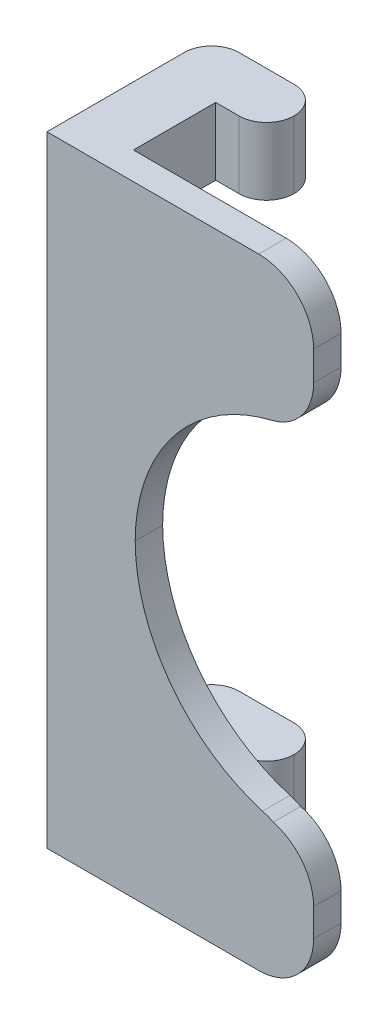
ISO-10303-21;
HEADER;
FILE_DESCRIPTION(('STEP AP214'),'2;1');
FILE_NAME('part.step','',(''),(''),'','','');
FILE_SCHEMA(('AUTOMOTIVE_DESIGN { 1 0 10303 214 1 1 1 1 }'));
ENDSEC;
DATA;
#1=APPLICATION_CONTEXT('core data for automotive mechanical design processes');
#2=APPLICATION_PROTOCOL_DEFINITION('international standard','automotive_design',2000,#1);
#3=PRODUCT_CONTEXT('',#1,'mechanical');
#4=PRODUCT('Part','Part','',(#3));
#5=PRODUCT_RELATED_PRODUCT_CATEGORY('part','',(#4));
#6=PRODUCT_DEFINITION_FORMATION('','',#4);
#7=PRODUCT_DEFINITION_CONTEXT('part definition',#1,'design');
#8=PRODUCT_DEFINITION('design','',#6,#7);
#9=PRODUCT_DEFINITION_SHAPE('','',#8);
#10=(LENGTH_UNIT() NAMED_UNIT(*) SI_UNIT(.MILLI.,.METRE.));
#11=(NAMED_UNIT(*) PLANE_ANGLE_UNIT() SI_UNIT($,.RADIAN.));
#12=(NAMED_UNIT(*) SI_UNIT($,.STERADIAN.) SOLID_ANGLE_UNIT());
#13=UNCERTAINTY_MEASURE_WITH_UNIT(LENGTH_MEASURE(1.E-05),#10,'distance_accuracy_value','');
#14=(GEOMETRIC_REPRESENTATION_CONTEXT(3) GLOBAL_UNCERTAINTY_ASSIGNED_CONTEXT((#13)) GLOBAL_UNIT_ASSIGNED_CONTEXT((#10,
#11,#12)) REPRESENTATION_CONTEXT('',''));
#15=CARTESIAN_POINT('',(0.,0.,0.));
#16=DIRECTION('',(0.,0.,1.));
#17=DIRECTION('',(1.,0.,0.));
#18=AXIS2_PLACEMENT_3D('',#15,#16,#17);
#19=CARTESIAN_POINT('',(0.,0.,0.));
#20=DIRECTION('',(0.,0.,1.));
#21=DIRECTION('',(1.,0.,0.));
#22=AXIS2_PLACEMENT_3D('',#19,#20,#21);
#23=PLANE('',#22);
#24=DIRECTION('',(1.,0.,0.));
#25=VECTOR('',#24,1.);
#26=CARTESIAN_POINT('',(0.,-36.4109482400217,0.));
#27=LINE('',#26,#25);
#28=CARTESIAN_POINT('',(52.7151769283594,-36.4109482400217,0.));
#29=VERTEX_POINT('',#28);
#30=CARTESIAN_POINT('',(58.2812352941176,-36.4109482400217,0.));
#31=VERTEX_POINT('',#30);
#32=EDGE_CURVE('E429',#29,#31,#27,.T.);
#33=ORIENTED_EDGE('',*,*,#32,.T.);
#34=CARTESIAN_POINT('',(58.2812352941176,-38.4109482400217,0.));
#35=DIRECTION('',(0.,0.,1.));
#36=DIRECTION('',(1.,0.,0.));
#37=AXIS2_PLACEMENT_3D('',#34,#35,#36);
#38=CIRCLE('',#37,2.);
#39=CARTESIAN_POINT('',(60.2812352941176,-38.4109482400217,0.));
#40=VERTEX_POINT('',#39);
#41=EDGE_CURVE('E490',#31,#40,#38,.F.);
#42=ORIENTED_EDGE('',*,*,#41,.T.);
#43=DIRECTION('',(0.,1.,0.));
#44=VECTOR('',#43,1.);
#45=CARTESIAN_POINT('',(60.2812352941176,-95.4267717694334,0.));
#46=LINE('',#45,#44);
#47=CARTESIAN_POINT('',(60.2812352941176,-39.4765924190925,0.));
#48=VERTEX_POINT('',#47);
#49=EDGE_CURVE('E248',#40,#48,#46,.F.);
#50=ORIENTED_EDGE('',*,*,#49,.T.);
#51=CARTESIAN_POINT('',(58.2812352941176,-39.4765924190925,0.));
#52=DIRECTION('',(0.,0.,1.));
#53=DIRECTION('',(1.,0.,0.));
#54=AXIS2_PLACEMENT_3D('',#51,#52,#53);
#55=CIRCLE('',#54,2.);
#56=CARTESIAN_POINT('',(58.7518235294118,-41.4204408475464,0.));
#57=VERTEX_POINT('',#56);
#58=EDGE_CURVE('E488',#48,#57,#55,.F.);
#59=ORIENTED_EDGE('',*,*,#58,.T.);
#60=CARTESIAN_POINT('',(60.2812352941176,-47.7379482400217,0.));
#61=DIRECTION('',(0.,0.,-1.));
#62=DIRECTION('',(1.,0.,0.));
#63=AXIS2_PLACEMENT_3D('',#60,#61,#62);
#64=CIRCLE('',#63,6.5);
#65=CARTESIAN_POINT('',(53.7812817026909,-47.7133858847167,0.));
#66=VERTEX_POINT('',#65);
#67=EDGE_CURVE('E246',#66,#57,#64,.T.);
#68=ORIENTED_EDGE('',*,*,#67,.F.);
#69=CARTESIAN_POINT('',(60.2812352941176,-47.6888235294118,0.));
#70=DIRECTION('',(0.,0.,1.));
#71=DIRECTION('',(1.,0.,0.));
#72=AXIS2_PLACEMENT_3D('',#69,#70,#71);
#73=CIRCLE('',#72,6.5);
#74=CARTESIAN_POINT('',(58.4222412319776,-53.9173178159089,0.));
#75=VERTEX_POINT('',#74);
#76=EDGE_CURVE('E433',#66,#75,#73,.T.);
#77=ORIENTED_EDGE('',*,*,#76,.T.);
#78=CARTESIAN_POINT('',(57.6776054850417,-59.0158235294118,0.));
#79=CARTESIAN_POINT('',(61.6748613716943,-59.0158235303762,0.));
#80=CARTESIAN_POINT('',(62.2525313016233,-55.060529347408,0.));
#81=CARTESIAN_POINT('',(58.4222412319776,-53.9173178159089,0.));
#82=(BOUNDED_CURVE() B_SPLINE_CURVE(3,(#78,#79,#80,#81),.UNSPECIFIED.,.F.,
.F.) B_SPLINE_CURVE_WITH_KNOTS((4,4),(0.,1.),
.UNSPECIFIED.) CURVE() GEOMETRIC_REPRESENTATION_ITEM() RATIONAL_B_SPLINE_CURVE((1.,
0.429677749837214,0.429677749837214,1.)) REPRESENTATION_ITEM(''));
#83=CARTESIAN_POINT('',(58.8167573565676,-54.0708231298666,0.));
#84=VERTEX_POINT('',#83);
#85=EDGE_CURVE('E560',#75,#84,#82,.F.);
#86=ORIENTED_EDGE('',*,*,#85,.T.);
#87=CARTESIAN_POINT('',(58.2812352941176,-55.9978247369354,0.));
#88=DIRECTION('',(0.,0.,1.));
#89=DIRECTION('',(1.,0.,0.));
#90=AXIS2_PLACEMENT_3D('',#87,#88,#89);
#91=CIRCLE('',#90,2.);
#92=CARTESIAN_POINT('',(60.2812352941176,-55.9978247369354,0.));
#93=VERTEX_POINT('',#92);
#94=EDGE_CURVE('E478',#84,#93,#91,.F.);
#95=ORIENTED_EDGE('',*,*,#94,.T.);
#96=DIRECTION('',(0.,1.,0.));
#97=VECTOR('',#96,1.);
#98=CARTESIAN_POINT('',(60.2812352941176,-95.4267717694334,0.));
#99=LINE('',#98,#97);
#100=CARTESIAN_POINT('',(60.2812352941176,-57.0158235294118,0.));
#101=VERTEX_POINT('',#100);
#102=EDGE_CURVE('E263',#93,#101,#99,.F.);
#103=ORIENTED_EDGE('',*,*,#102,.T.);
#104=CARTESIAN_POINT('',(58.2812352941176,-57.0158235294118,0.));
#105=DIRECTION('',(0.,0.,1.));
#106=DIRECTION('',(1.,0.,0.));
#107=AXIS2_PLACEMENT_3D('',#104,#105,#106);
#108=CIRCLE('',#107,2.);
#109=CARTESIAN_POINT('',(58.2812352941176,-59.0158235294118,0.));
#110=VERTEX_POINT('',#109);
#111=EDGE_CURVE('E484',#101,#110,#108,.F.);
#112=ORIENTED_EDGE('',*,*,#111,.T.);
#113=DIRECTION('',(1.,0.,0.));
#114=VECTOR('',#113,1.);
#115=CARTESIAN_POINT('',(0.,-59.0158235294118,0.));
#116=LINE('',#115,#114);
#117=CARTESIAN_POINT('',(52.7151769283594,-59.0158235294118,0.));
#118=VERTEX_POINT('',#117);
#119=EDGE_CURVE('E412',#118,#110,#116,.T.);
#120=ORIENTED_EDGE('',*,*,#119,.F.);
#121=DIRECTION('',(0.,-1.,0.));
#122=VECTOR('',#121,1.);
#123=CARTESIAN_POINT('',(52.7151769283594,0.,0.));
#124=LINE('',#123,#122);
#125=CARTESIAN_POINT('',(52.7151769283594,-56.5609482400217,0.));
#126=VERTEX_POINT('',#125);
#127=EDGE_CURVE('E450',#126,#118,#124,.T.);
#128=ORIENTED_EDGE('',*,*,#127,.F.);
#129=DIRECTION('',(1.,0.,0.));
#130=VECTOR('',#129,1.);
#131=CARTESIAN_POINT('',(0.,-56.5609482400217,0.));
#132=LINE('',#131,#130);
#133=CARTESIAN_POINT('',(50.5662352941177,-56.5609482400217,0.));
#134=VERTEX_POINT('',#133);
#135=EDGE_CURVE('E238',#134,#126,#132,.T.);
#136=ORIENTED_EDGE('',*,*,#135,.F.);
#137=DIRECTION('',(0.,1.,0.));
#138=VECTOR('',#137,1.);
#139=CARTESIAN_POINT('',(50.5662352941177,0.,0.));
#140=LINE('',#139,#138);
#141=CARTESIAN_POINT('',(50.5662352941177,-38.8658235294118,0.));
#142=VERTEX_POINT('',#141);
#143=EDGE_CURVE('E432',#134,#142,#140,.T.);
#144=ORIENTED_EDGE('',*,*,#143,.T.);
#145=DIRECTION('',(1.,0.,0.));
#146=VECTOR('',#145,1.);
#147=CARTESIAN_POINT('',(0.,-38.8658235294118,0.));
#148=LINE('',#147,#146);
#149=CARTESIAN_POINT('',(52.7151769283594,-38.8658235294118,0.));
#150=VERTEX_POINT('',#149);
#151=EDGE_CURVE('E434',#142,#150,#148,.T.);
#152=ORIENTED_EDGE('',*,*,#151,.T.);
#153=DIRECTION('',(0.,1.,0.));
#154=VECTOR('',#153,1.);
#155=CARTESIAN_POINT('',(52.7151769283594,0.,0.));
#156=LINE('',#155,#154);
#157=EDGE_CURVE('E557',#150,#29,#156,.T.);
#158=ORIENTED_EDGE('',*,*,#157,.T.);
#159=EDGE_LOOP('',(#33,#42,#50,#59,#68,#77,#86,#95,#103,#112,#120,#128,#136,#144,#152,#158));
#160=FACE_BOUND('',#159,.T.);
#161=ADVANCED_FACE('F37',(#160),#23,.F.);
#162=CARTESIAN_POINT('',(58.4222412322629,-53.9173178159941,1.1));
#163=CARTESIAN_POINT('',(58.4222412322629,-53.9173178159941,1.06666666666667));
#164=CARTESIAN_POINT('',(58.4222412319776,-53.9173178159089,1.03333333333333));
#165=CARTESIAN_POINT('',(58.4222412319776,-53.9173178159089,0.666666666666658));
#166=CARTESIAN_POINT('',(58.4222412319776,-53.9173178159089,0.333333333333323));
#167=CARTESIAN_POINT('',(58.4222412319776,-53.9173178159089,-0.0333333333333324));
#168=CARTESIAN_POINT('',(58.4222412322629,-53.9173178159941,-0.066666666666667));
#169=CARTESIAN_POINT('',(58.4222412322629,-53.9173178159941,-0.1));
#170=CARTESIAN_POINT('',(62.2525313012011,-55.0605293474134,1.1));
#171=CARTESIAN_POINT('',(62.2525313012011,-55.0605293474134,1.06666666666667));
#172=CARTESIAN_POINT('',(62.2525313016233,-55.060529347408,1.03333333333333));
#173=CARTESIAN_POINT('',(62.2525313016233,-55.060529347408,0.666666666666658));
#174=CARTESIAN_POINT('',(62.2525313016233,-55.060529347408,0.333333333333323));
#175=CARTESIAN_POINT('',(62.2525313016233,-55.060529347408,-0.0333333333333324));
#176=CARTESIAN_POINT('',(62.2525313012011,-55.0605293474134,-0.066666666666667));
#177=CARTESIAN_POINT('',(62.2525313012011,-55.0605293474134,-0.1));
#178=CARTESIAN_POINT('',(61.6748613715533,-59.0158235298299,1.1));
#179=CARTESIAN_POINT('',(61.6748613715533,-59.0158235298299,1.06666666666667));
#180=CARTESIAN_POINT('',(61.6748613716943,-59.0158235303762,1.03333333333333));
#181=CARTESIAN_POINT('',(61.6748613716943,-59.0158235303762,0.666666666666658));
#182=CARTESIAN_POINT('',(61.6748613716943,-59.0158235303762,0.333333333333323));
#183=CARTESIAN_POINT('',(61.6748613716943,-59.0158235303762,-0.0333333333333324));
#184=CARTESIAN_POINT('',(61.6748613715533,-59.0158235298299,-0.066666666666667));
#185=CARTESIAN_POINT('',(61.6748613715533,-59.0158235298299,-0.1));
#186=CARTESIAN_POINT('',(57.6776054856014,-59.0158235294118,1.1));
#187=CARTESIAN_POINT('',(57.6776054856014,-59.0158235294118,1.06666666666667));
#188=CARTESIAN_POINT('',(57.6776054850417,-59.0158235294118,1.03333333333333));
#189=CARTESIAN_POINT('',(57.6776054850417,-59.0158235294118,0.666666666666658));
#190=CARTESIAN_POINT('',(57.6776054850417,-59.0158235294118,0.333333333333323));
#191=CARTESIAN_POINT('',(57.6776054850417,-59.0158235294118,-0.0333333333333324));
#192=CARTESIAN_POINT('',(57.6776054856014,-59.0158235294118,-0.066666666666667));
#193=CARTESIAN_POINT('',(57.6776054856014,-59.0158235294118,-0.1));
#194=(BOUNDED_SURFACE() B_SPLINE_SURFACE(3,3,((#162,#163,#164,#165,#166,#167,#168,#169),(#170,
#171,#172,#173,#174,#175,#176,#177),(#178,#179,#180,#181,#182,#183,#184,#185),(#186,#187,#188,
#189,#190,#191,#192,#193)),.UNSPECIFIED.,.F.,.F.,.F.) B_SPLINE_SURFACE_WITH_KNOTS((4,4),(4,2,2,
4),(0.,1.),(-0.1,0.,1.,1.1),
.UNSPECIFIED.) GEOMETRIC_REPRESENTATION_ITEM() RATIONAL_B_SPLINE_SURFACE(((1.,1.,1.,1.,1.,1.,1.,
1.),(0.429677749892681,0.429677749892681,0.429677749837214,0.429677749837214,0.429677749837214,
0.429677749837214,0.429677749892681,0.429677749892681),(0.429677749892681,0.429677749892681,
0.429677749837214,0.429677749837214,0.429677749837214,0.429677749837214,0.429677749892681,
0.429677749892681),(1.,1.,1.,1.,1.,1.,1.,1.))) REPRESENTATION_ITEM('') SURFACE());
#195=CARTESIAN_POINT('',(58.4222412319776,-53.9173178159089,1.));
#196=CARTESIAN_POINT('',(62.2525313016233,-55.060529347408,1.));
#197=CARTESIAN_POINT('',(61.6748613716943,-59.0158235303762,1.));
#198=CARTESIAN_POINT('',(57.6776054850417,-59.0158235294118,1.));
#199=(BOUNDED_CURVE() B_SPLINE_CURVE(3,(#195,#196,#197,#198),.UNSPECIFIED.,.F.,
.F.) B_SPLINE_CURVE_WITH_KNOTS((4,4),(0.,1.),
.UNSPECIFIED.) CURVE() GEOMETRIC_REPRESENTATION_ITEM() RATIONAL_B_SPLINE_CURVE((1.,
0.429677749837214,0.429677749837214,1.)) REPRESENTATION_ITEM(''));
#200=CARTESIAN_POINT('',(58.8168564094262,-54.0708460350338,1.));
#201=VERTEX_POINT('',#200);
#202=CARTESIAN_POINT('',(58.4222412319776,-53.9173178159089,1.));
#203=VERTEX_POINT('',#202);
#204=EDGE_CURVE('E405',#201,#203,#199,.F.);
#205=CARTESIAN_POINT('',(58.8160917387916,-54.0706691688394,1.00000000000002));
#206=CARTESIAN_POINT('',(58.816091738614,-54.0706691687983,0.900000000000013));
#207=CARTESIAN_POINT('',(58.8160917385301,-54.0706691687789,0.800000000000009));
#208=CARTESIAN_POINT('',(58.816091738461,-54.0706691687629,0.600000000000002));
#209=CARTESIAN_POINT('',(58.8160917384759,-54.0706691687664,0.499999999999998));
#210=CARTESIAN_POINT('',(58.8160917385219,-54.0706691687771,0.266666666666663));
#211=CARTESIAN_POINT('',(58.816091738557,-54.0706691687852,0.133333333333332));
#212=CARTESIAN_POINT('',(58.8160917384956,-54.0706691687709,0.));
#213=B_SPLINE_CURVE_WITH_KNOTS('',3,(#205,#206,#207,#208,#209,#210,#211,#212),.UNSPECIFIED.,.F.,
.F.,(4,2,2,4),(0.,0.300000000000011,0.600000000000023,1.00000000000002),.UNSPECIFIED.);
#214=EDGE_CURVE('E267',#201,#84,#213,.T.);
#215=CARTESIAN_POINT('',(58.4222412322629,-53.9173178159941,-0.1));
#216=CARTESIAN_POINT('',(58.4222412322629,-53.9173178159941,-0.066666666666667));
#217=CARTESIAN_POINT('',(58.4222412319776,-53.9173178159089,-0.0333333333333324));
#218=CARTESIAN_POINT('',(58.4222412319776,-53.9173178159089,0.333333333333323));
#219=CARTESIAN_POINT('',(58.4222412319776,-53.9173178159089,0.666666666666658));
#220=CARTESIAN_POINT('',(58.4222412319776,-53.9173178159089,1.03333333333333));
#221=CARTESIAN_POINT('',(58.4222412322629,-53.9173178159941,1.06666666666667));
#222=CARTESIAN_POINT('',(58.4222412322629,-53.9173178159941,1.1));
#223=(BOUNDED_CURVE() B_SPLINE_CURVE(3,(#215,#216,#217,#218,#219,#220,#221,#222),.UNSPECIFIED.,
.F.,.F.) B_SPLINE_CURVE_WITH_KNOTS((4,2,2,4),(-0.1,0.,1.,1.1),
.UNSPECIFIED.) CURVE() GEOMETRIC_REPRESENTATION_ITEM() RATIONAL_B_SPLINE_CURVE((1.,1.,1.,1.,1.,
1.,1.,1.)) REPRESENTATION_ITEM(''));
#224=EDGE_CURVE('E383',#203,#75,#223,.F.);
#225=ORIENTED_EDGE('',*,*,#204,.F.);
#226=ORIENTED_EDGE('',*,*,#214,.T.);
#227=ORIENTED_EDGE('',*,*,#85,.F.);
#228=ORIENTED_EDGE('',*,*,#224,.F.);
#229=EDGE_LOOP('',(#225,#226,#227,#228));
#230=FACE_BOUND('',#229,.T.);
#231=ADVANCED_FACE('F283',(#230),#194,.T.);
#232=CARTESIAN_POINT('',(60.2812352941176,-47.6888235294118,1.));
#233=DIRECTION('',(0.,0.,-1.));
#234=DIRECTION('',(-1.,0.,0.));
#235=AXIS2_PLACEMENT_3D('',#232,#233,#234);
#236=CYLINDRICAL_SURFACE('',#235,6.5);
#237=ORIENTED_EDGE('',*,*,#76,.F.);
#238=DIRECTION('',(0.,0.,-1.));
#239=VECTOR('',#238,1.);
#240=CARTESIAN_POINT('',(53.7812817026909,-47.7133858847167,0.5));
#241=LINE('',#240,#239);
#242=CARTESIAN_POINT('',(53.7812817026909,-47.7133858847167,1.));
#243=VERTEX_POINT('',#242);
#244=EDGE_CURVE('E264',#66,#243,#241,.F.);
#245=ORIENTED_EDGE('',*,*,#244,.T.);
#246=CARTESIAN_POINT('',(60.2812352941176,-47.6888235294118,1.));
#247=DIRECTION('',(0.,0.,1.));
#248=DIRECTION('',(1.,0.,0.));
#249=AXIS2_PLACEMENT_3D('',#246,#247,#248);
#250=CIRCLE('',#249,6.5);
#251=EDGE_CURVE('E408',#243,#203,#250,.T.);
#252=ORIENTED_EDGE('',*,*,#251,.T.);
#253=ORIENTED_EDGE('',*,*,#224,.T.);
#254=EDGE_LOOP('',(#237,#245,#252,#253));
#255=FACE_BOUND('',#254,.T.);
#256=ADVANCED_FACE('F355',(#255),#236,.F.);
#257=CARTESIAN_POINT('',(0.,-36.4109482400217,1.));
#258=DIRECTION('',(0.,1.,0.));
#259=DIRECTION('',(0.,0.,1.));
#260=AXIS2_PLACEMENT_3D('',#257,#258,#259);
#261=PLANE('',#260);
#262=DIRECTION('',(1.,0.,0.));
#263=VECTOR('',#262,1.);
#264=CARTESIAN_POINT('',(0.,-36.4109482400217,1.));
#265=LINE('',#264,#263);
#266=CARTESIAN_POINT('',(50.5662352941177,-36.4109482400217,1.));
#267=VERTEX_POINT('',#266);
#268=CARTESIAN_POINT('',(58.2812352941176,-36.4109482400217,1.));
#269=VERTEX_POINT('',#268);
#270=EDGE_CURVE('E411',#267,#269,#265,.T.);
#271=ORIENTED_EDGE('',*,*,#270,.T.);
#272=DIRECTION('',(0.,0.,-1.));
#273=VECTOR('',#272,1.);
#274=CARTESIAN_POINT('',(58.2812352941176,-36.4109482400217,1.));
#275=LINE('',#274,#273);
#276=EDGE_CURVE('E473',#269,#31,#275,.T.);
#277=ORIENTED_EDGE('',*,*,#276,.T.);
#278=ORIENTED_EDGE('',*,*,#32,.F.);
#279=DIRECTION('',(0.,0.,1.));
#280=VECTOR('',#279,1.);
#281=CARTESIAN_POINT('',(52.7151769283594,-36.4109482400217,-6.2625699737838));
#282=LINE('',#281,#280);
#283=CARTESIAN_POINT('',(52.7151769283594,-36.4109482400217,-3.));
#284=VERTEX_POINT('',#283);
#285=EDGE_CURVE('E531',#284,#29,#282,.T.);
#286=ORIENTED_EDGE('',*,*,#285,.F.);
#287=DIRECTION('',(1.,0.,0.));
#288=VECTOR('',#287,1.);
#289=CARTESIAN_POINT('',(50.5662352941177,-36.4109482400217,-3.));
#290=LINE('',#289,#288);
#291=CARTESIAN_POINT('',(53.5662352941177,-36.4109482400217,-3.));
#292=VERTEX_POINT('',#291);
#293=EDGE_CURVE('E536',#284,#292,#290,.T.);
#294=ORIENTED_EDGE('',*,*,#293,.T.);
#295=CARTESIAN_POINT('',(53.5662352941177,-36.4109482400217,-4.));
#296=DIRECTION('',(0.,1.,0.));
#297=DIRECTION('',(0.,0.,1.));
#298=AXIS2_PLACEMENT_3D('',#295,#296,#297);
#299=CIRCLE('',#298,1.);
#300=CARTESIAN_POINT('',(54.5662352941177,-36.4109482400217,-4.));
#301=VERTEX_POINT('',#300);
#302=EDGE_CURVE('E543',#292,#301,#299,.T.);
#303=ORIENTED_EDGE('',*,*,#302,.T.);
#304=CARTESIAN_POINT('',(53.5662352941177,-36.4109482400217,-4.));
#305=DIRECTION('',(0.,1.,0.));
#306=DIRECTION('',(0.,0.,1.));
#307=AXIS2_PLACEMENT_3D('',#304,#305,#306);
#308=CIRCLE('',#307,1.);
#309=CARTESIAN_POINT('',(53.5662352941177,-36.4109482400217,-5.));
#310=VERTEX_POINT('',#309);
#311=EDGE_CURVE('E545',#301,#310,#308,.T.);
#312=ORIENTED_EDGE('',*,*,#311,.T.);
#313=DIRECTION('',(1.,0.,0.));
#314=VECTOR('',#313,1.);
#315=CARTESIAN_POINT('',(50.5662352941177,-36.4109482400217,-5.));
#316=LINE('',#315,#314);
#317=CARTESIAN_POINT('',(51.5662352941177,-36.4109482400217,-5.));
#318=VERTEX_POINT('',#317);
#319=EDGE_CURVE('E280',#318,#310,#316,.T.);
#320=ORIENTED_EDGE('',*,*,#319,.F.);
#321=CARTESIAN_POINT('',(51.5662352941177,-36.4109482400217,-4.));
#322=DIRECTION('',(0.,1.,0.));
#323=DIRECTION('',(0.,0.,1.));
#324=AXIS2_PLACEMENT_3D('',#321,#322,#323);
#325=CIRCLE('',#324,1.);
#326=CARTESIAN_POINT('',(50.5662352941177,-36.4109482400217,-4.));
#327=VERTEX_POINT('',#326);
#328=EDGE_CURVE('E547',#318,#327,#325,.T.);
#329=ORIENTED_EDGE('',*,*,#328,.T.);
#330=DIRECTION('',(0.,0.,-1.));
#331=VECTOR('',#330,1.);
#332=CARTESIAN_POINT('',(50.5662352941177,-36.4109482400217,1.));
#333=LINE('',#332,#331);
#334=EDGE_CURVE('E518',#267,#327,#333,.T.);
#335=ORIENTED_EDGE('',*,*,#334,.F.);
#336=EDGE_LOOP('',(#271,#277,#278,#286,#294,#303,#312,#320,#329,#335));
#337=FACE_BOUND('',#336,.T.);
#338=ADVANCED_FACE('F515',(#337),#261,.T.);
#339=CARTESIAN_POINT('',(50.5662352941177,0.,1.));
#340=DIRECTION('',(-1.,0.,0.));
#341=DIRECTION('',(0.,0.,1.));
#342=AXIS2_PLACEMENT_3D('',#339,#340,#341);
#343=PLANE('',#342);
#344=DIRECTION('',(0.,0.,1.));
#345=VECTOR('',#344,1.);
#346=CARTESIAN_POINT('',(50.5662352941177,-56.5609482400217,-6.2625699737838));
#347=LINE('',#346,#345);
#348=CARTESIAN_POINT('',(50.5662352941177,-56.5609482400217,-4.));
#349=VERTEX_POINT('',#348);
#350=EDGE_CURVE('E241',#349,#134,#347,.T.);
#351=ORIENTED_EDGE('',*,*,#350,.F.);
#352=DIRECTION('',(0.,-1.,0.));
#353=VECTOR('',#352,1.);
#354=CARTESIAN_POINT('',(50.5662352941177,-59.0158235294118,-4.));
#355=LINE('',#354,#353);
#356=CARTESIAN_POINT('',(50.5662352941177,-59.0158235294118,-4.));
#357=VERTEX_POINT('',#356);
#358=EDGE_CURVE('E470',#349,#357,#355,.T.);
#359=ORIENTED_EDGE('',*,*,#358,.T.);
#360=DIRECTION('',(0.,0.,-1.));
#361=VECTOR('',#360,1.);
#362=CARTESIAN_POINT('',(50.5662352941177,-59.0158235294118,1.));
#363=LINE('',#362,#361);
#364=CARTESIAN_POINT('',(50.5662352941177,-59.0158235294118,1.));
#365=VERTEX_POINT('',#364);
#366=EDGE_CURVE('E443',#365,#357,#363,.T.);
#367=ORIENTED_EDGE('',*,*,#366,.F.);
#368=DIRECTION('',(0.,1.,0.));
#369=VECTOR('',#368,1.);
#370=CARTESIAN_POINT('',(50.5662352941177,0.,1.));
#371=LINE('',#370,#369);
#372=EDGE_CURVE('E422',#365,#267,#371,.T.);
#373=ORIENTED_EDGE('',*,*,#372,.T.);
#374=ORIENTED_EDGE('',*,*,#334,.T.);
#375=DIRECTION('',(0.,1.,0.));
#376=VECTOR('',#375,1.);
#377=CARTESIAN_POINT('',(50.5662352941177,-38.8658235294118,-4.));
#378=LINE('',#377,#376);
#379=CARTESIAN_POINT('',(50.5662352941177,-38.8658235294118,-4.));
#380=VERTEX_POINT('',#379);
#381=EDGE_CURVE('E451',#327,#380,#378,.F.);
#382=ORIENTED_EDGE('',*,*,#381,.T.);
#383=DIRECTION('',(0.,0.,1.));
#384=VECTOR('',#383,1.);
#385=CARTESIAN_POINT('',(50.5662352941177,-38.8658235294118,-6.2625699737838));
#386=LINE('',#385,#384);
#387=EDGE_CURVE('E418',#380,#142,#386,.T.);
#388=ORIENTED_EDGE('',*,*,#387,.T.);
#389=ORIENTED_EDGE('',*,*,#143,.F.);
#390=EDGE_LOOP('',(#351,#359,#367,#373,#374,#382,#388,#389));
#391=FACE_BOUND('',#390,.T.);
#392=ADVANCED_FACE('F578',(#391),#343,.T.);
#393=CARTESIAN_POINT('',(0.,-59.0158235294118,1.));
#394=DIRECTION('',(0.,1.,0.));
#395=DIRECTION('',(0.,0.,1.));
#396=AXIS2_PLACEMENT_3D('',#393,#394,#395);
#397=PLANE('',#396);
#398=ORIENTED_EDGE('',*,*,#119,.T.);
#399=DIRECTION('',(0.,0.,-1.));
#400=VECTOR('',#399,1.);
#401=CARTESIAN_POINT('',(58.2812352941176,-59.0158235294118,1.));
#402=LINE('',#401,#400);
#403=CARTESIAN_POINT('',(58.2812352941176,-59.0158235294118,1.));
#404=VERTEX_POINT('',#403);
#405=EDGE_CURVE('E11',#110,#404,#402,.F.);
#406=ORIENTED_EDGE('',*,*,#405,.T.);
#407=DIRECTION('',(1.,0.,0.));
#408=VECTOR('',#407,1.);
#409=CARTESIAN_POINT('',(0.,-59.0158235294118,1.));
#410=LINE('',#409,#408);
#411=EDGE_CURVE('E564',#365,#404,#410,.T.);
#412=ORIENTED_EDGE('',*,*,#411,.F.);
#413=ORIENTED_EDGE('',*,*,#366,.T.);
#414=CARTESIAN_POINT('',(51.5662352941177,-59.0158235294118,-4.));
#415=DIRECTION('',(0.,1.,0.));
#416=DIRECTION('',(0.,0.,1.));
#417=AXIS2_PLACEMENT_3D('',#414,#415,#416);
#418=CIRCLE('',#417,1.);
#419=CARTESIAN_POINT('',(51.5662352941177,-59.0158235294118,-5.));
#420=VERTEX_POINT('',#419);
#421=EDGE_CURVE('E460',#357,#420,#418,.F.);
#422=ORIENTED_EDGE('',*,*,#421,.T.);
#423=DIRECTION('',(1.,0.,0.));
#424=VECTOR('',#423,1.);
#425=CARTESIAN_POINT('',(50.5662352941177,-59.0158235294118,-5.));
#426=LINE('',#425,#424);
#427=CARTESIAN_POINT('',(53.5662352941177,-59.0158235294118,-5.));
#428=VERTEX_POINT('',#427);
#429=EDGE_CURVE('E254',#420,#428,#426,.T.);
#430=ORIENTED_EDGE('',*,*,#429,.T.);
#431=CARTESIAN_POINT('',(53.5662352941177,-59.0158235294118,-4.));
#432=DIRECTION('',(0.,1.,0.));
#433=DIRECTION('',(0.,0.,1.));
#434=AXIS2_PLACEMENT_3D('',#431,#432,#433);
#435=CIRCLE('',#434,1.);
#436=CARTESIAN_POINT('',(54.5662352941177,-59.0158235294118,-4.));
#437=VERTEX_POINT('',#436);
#438=EDGE_CURVE('E462',#428,#437,#435,.F.);
#439=ORIENTED_EDGE('',*,*,#438,.T.);
#440=CARTESIAN_POINT('',(53.5662352941177,-59.0158235294118,-4.));
#441=DIRECTION('',(0.,1.,0.));
#442=DIRECTION('',(0.,0.,1.));
#443=AXIS2_PLACEMENT_3D('',#440,#441,#442);
#444=CIRCLE('',#443,1.);
#445=CARTESIAN_POINT('',(53.5662352941177,-59.0158235294118,-3.));
#446=VERTEX_POINT('',#445);
#447=EDGE_CURVE('E464',#437,#446,#444,.F.);
#448=ORIENTED_EDGE('',*,*,#447,.T.);
#449=DIRECTION('',(1.,0.,0.));
#450=VECTOR('',#449,1.);
#451=CARTESIAN_POINT('',(50.5662352941177,-59.0158235294118,-3.));
#452=LINE('',#451,#450);
#453=CARTESIAN_POINT('',(52.7151769283594,-59.0158235294118,-3.));
#454=VERTEX_POINT('',#453);
#455=EDGE_CURVE('E230',#454,#446,#452,.T.);
#456=ORIENTED_EDGE('',*,*,#455,.F.);
#457=DIRECTION('',(0.,0.,1.));
#458=VECTOR('',#457,1.);
#459=CARTESIAN_POINT('',(52.7151769283594,-59.0158235294118,-6.2625699737838));
#460=LINE('',#459,#458);
#461=EDGE_CURVE('E242',#454,#118,#460,.T.);
#462=ORIENTED_EDGE('',*,*,#461,.T.);
#463=EDGE_LOOP('',(#398,#406,#412,#413,#422,#430,#439,#448,#456,#462));
#464=FACE_BOUND('',#463,.T.);
#465=ADVANCED_FACE('F364',(#464),#397,.F.);
#466=CARTESIAN_POINT('',(0.,0.,1.));
#467=DIRECTION('',(0.,0.,1.));
#468=DIRECTION('',(1.,0.,0.));
#469=AXIS2_PLACEMENT_3D('',#466,#467,#468);
#470=PLANE('',#469);
#471=DIRECTION('',(0.,-1.,0.));
#472=VECTOR('',#471,1.);
#473=CARTESIAN_POINT('',(60.2812352941176,-95.4267717694334,1.));
#474=LINE('',#473,#472);
#475=CARTESIAN_POINT('',(60.2812352941176,-38.4109482400217,1.));
#476=VERTEX_POINT('',#475);
#477=CARTESIAN_POINT('',(60.2812352941176,-39.4765924190925,1.));
#478=VERTEX_POINT('',#477);
#479=EDGE_CURVE('E262',#476,#478,#474,.T.);
#480=ORIENTED_EDGE('',*,*,#479,.F.);
#481=CARTESIAN_POINT('',(58.2812352941176,-38.4109482400217,1.));
#482=DIRECTION('',(0.,0.,1.));
#483=DIRECTION('',(1.,0.,0.));
#484=AXIS2_PLACEMENT_3D('',#481,#482,#483);
#485=CIRCLE('',#484,2.);
#486=EDGE_CURVE('E506',#476,#269,#485,.T.);
#487=ORIENTED_EDGE('',*,*,#486,.T.);
#488=ORIENTED_EDGE('',*,*,#270,.F.);
#489=ORIENTED_EDGE('',*,*,#372,.F.);
#490=ORIENTED_EDGE('',*,*,#411,.T.);
#491=CARTESIAN_POINT('',(58.2812352941176,-57.0158235294118,1.));
#492=DIRECTION('',(0.,0.,1.));
#493=DIRECTION('',(1.,0.,0.));
#494=AXIS2_PLACEMENT_3D('',#491,#492,#493);
#495=CIRCLE('',#494,2.);
#496=CARTESIAN_POINT('',(60.2812352941176,-57.0158235294118,1.));
#497=VERTEX_POINT('',#496);
#498=EDGE_CURVE('E67',#404,#497,#495,.T.);
#499=ORIENTED_EDGE('',*,*,#498,.T.);
#500=CARTESIAN_POINT('',(60.2812352941176,-55.9978247369354,1.));
#501=VERTEX_POINT('',#500);
#502=EDGE_CURVE('E268',#501,#497,#474,.T.);
#503=ORIENTED_EDGE('',*,*,#502,.F.);
#504=CARTESIAN_POINT('',(58.2812352941176,-55.9978247369354,1.));
#505=DIRECTION('',(0.,0.,1.));
#506=DIRECTION('',(1.,0.,0.));
#507=AXIS2_PLACEMENT_3D('',#504,#505,#506);
#508=CIRCLE('',#507,2.);
#509=EDGE_CURVE('E499',#501,#201,#508,.T.);
#510=ORIENTED_EDGE('',*,*,#509,.T.);
#511=ORIENTED_EDGE('',*,*,#204,.T.);
#512=ORIENTED_EDGE('',*,*,#251,.F.);
#513=CARTESIAN_POINT('',(60.2812352941176,-47.7379482400217,1.));
#514=DIRECTION('',(0.,0.,-1.));
#515=DIRECTION('',(1.,0.,0.));
#516=AXIS2_PLACEMENT_3D('',#513,#514,#515);
#517=CIRCLE('',#516,6.5);
#518=CARTESIAN_POINT('',(58.7518235294118,-41.4204408475464,1.));
#519=VERTEX_POINT('',#518);
#520=EDGE_CURVE('E260',#243,#519,#517,.T.);
#521=ORIENTED_EDGE('',*,*,#520,.T.);
#522=CARTESIAN_POINT('',(58.2812352941176,-39.4765924190925,1.));
#523=DIRECTION('',(0.,0.,1.));
#524=DIRECTION('',(1.,0.,0.));
#525=AXIS2_PLACEMENT_3D('',#522,#523,#524);
#526=CIRCLE('',#525,2.);
#527=EDGE_CURVE('E505',#519,#478,#526,.T.);
#528=ORIENTED_EDGE('',*,*,#527,.T.);
#529=EDGE_LOOP('',(#480,#487,#488,#489,#490,#499,#503,#510,#511,#512,#521,#528));
#530=FACE_BOUND('',#529,.T.);
#531=ADVANCED_FACE('F361',(#530),#470,.T.);
#532=CARTESIAN_POINT('',(52.7151769283594,-36.4109482400217,-6.2625699737838));
#533=DIRECTION('',(1.,0.,0.));
#534=DIRECTION('',(0.,0.,-1.));
#535=AXIS2_PLACEMENT_3D('',#532,#533,#534);
#536=PLANE('',#535);
#537=ORIENTED_EDGE('',*,*,#157,.F.);
#538=DIRECTION('',(0.,0.,1.));
#539=VECTOR('',#538,1.);
#540=CARTESIAN_POINT('',(52.7151769283594,-38.8658235294118,-6.2625699737838));
#541=LINE('',#540,#539);
#542=CARTESIAN_POINT('',(52.7151769283594,-38.8658235294118,-3.));
#543=VERTEX_POINT('',#542);
#544=EDGE_CURVE('E645',#543,#150,#541,.T.);
#545=ORIENTED_EDGE('',*,*,#544,.F.);
#546=DIRECTION('',(0.,-1.,0.));
#547=VECTOR('',#546,1.);
#548=CARTESIAN_POINT('',(52.7151769283594,-36.4109482400217,-3.));
#549=LINE('',#548,#547);
#550=EDGE_CURVE('E529',#284,#543,#549,.T.);
#551=ORIENTED_EDGE('',*,*,#550,.F.);
#552=ORIENTED_EDGE('',*,*,#285,.T.);
#553=EDGE_LOOP('',(#537,#545,#551,#552));
#554=FACE_BOUND('',#553,.T.);
#555=ADVANCED_FACE('F661',(#554),#536,.T.);
#556=CARTESIAN_POINT('',(50.5662352941177,-38.8658235294118,-6.2625699737838));
#557=DIRECTION('',(0.,-1.,0.));
#558=DIRECTION('',(0.,0.,-1.));
#559=AXIS2_PLACEMENT_3D('',#556,#557,#558);
#560=PLANE('',#559);
#561=CARTESIAN_POINT('',(53.5662352941177,-38.8658235294118,-4.));
#562=DIRECTION('',(0.,-1.,0.));
#563=DIRECTION('',(0.,0.,-1.));
#564=AXIS2_PLACEMENT_3D('',#561,#562,#563);
#565=CIRCLE('',#564,1.);
#566=CARTESIAN_POINT('',(53.5662352941177,-38.8658235294118,-5.));
#567=VERTEX_POINT('',#566);
#568=CARTESIAN_POINT('',(54.5662352941177,-38.8658235294118,-4.));
#569=VERTEX_POINT('',#568);
#570=EDGE_CURVE('E554',#567,#569,#565,.T.);
#571=ORIENTED_EDGE('',*,*,#570,.T.);
#572=CARTESIAN_POINT('',(53.5662352941177,-38.8658235294118,-4.));
#573=DIRECTION('',(0.,-1.,0.));
#574=DIRECTION('',(0.,0.,-1.));
#575=AXIS2_PLACEMENT_3D('',#572,#573,#574);
#576=CIRCLE('',#575,1.);
#577=CARTESIAN_POINT('',(53.5662352941177,-38.8658235294118,-3.));
#578=VERTEX_POINT('',#577);
#579=EDGE_CURVE('E552',#569,#578,#576,.T.);
#580=ORIENTED_EDGE('',*,*,#579,.T.);
#581=DIRECTION('',(-1.,0.,0.));
#582=VECTOR('',#581,1.);
#583=CARTESIAN_POINT('',(50.5662352941177,-38.8658235294118,-3.));
#584=LINE('',#583,#582);
#585=EDGE_CURVE('E639',#578,#543,#584,.T.);
#586=ORIENTED_EDGE('',*,*,#585,.T.);
#587=ORIENTED_EDGE('',*,*,#544,.T.);
#588=ORIENTED_EDGE('',*,*,#151,.F.);
#589=ORIENTED_EDGE('',*,*,#387,.F.);
#590=CARTESIAN_POINT('',(51.5662352941177,-38.8658235294118,-4.));
#591=DIRECTION('',(0.,-1.,0.));
#592=DIRECTION('',(0.,0.,-1.));
#593=AXIS2_PLACEMENT_3D('',#590,#591,#592);
#594=CIRCLE('',#593,1.);
#595=CARTESIAN_POINT('',(51.5662352941177,-38.8658235294118,-5.));
#596=VERTEX_POINT('',#595);
#597=EDGE_CURVE('E556',#380,#596,#594,.T.);
#598=ORIENTED_EDGE('',*,*,#597,.T.);
#599=DIRECTION('',(-1.,0.,0.));
#600=VECTOR('',#599,1.);
#601=CARTESIAN_POINT('',(50.5662352941177,-38.8658235294118,-5.));
#602=LINE('',#601,#600);
#603=EDGE_CURVE('E643',#567,#596,#602,.T.);
#604=ORIENTED_EDGE('',*,*,#603,.F.);
#605=EDGE_LOOP('',(#571,#580,#586,#587,#588,#589,#598,#604));
#606=FACE_BOUND('',#605,.T.);
#607=ADVANCED_FACE('F657',(#606),#560,.T.);
#608=CARTESIAN_POINT('',(0.,0.,-5.));
#609=DIRECTION('',(0.,0.,1.));
#610=DIRECTION('',(1.,0.,0.));
#611=AXIS2_PLACEMENT_3D('',#608,#609,#610);
#612=PLANE('',#611);
#613=ORIENTED_EDGE('',*,*,#319,.T.);
#614=DIRECTION('',(0.,-1.,0.));
#615=VECTOR('',#614,1.);
#616=CARTESIAN_POINT('',(53.5662352941177,0.,-5.));
#617=LINE('',#616,#615);
#618=EDGE_CURVE('E538',#310,#567,#617,.T.);
#619=ORIENTED_EDGE('',*,*,#618,.T.);
#620=ORIENTED_EDGE('',*,*,#603,.T.);
#621=DIRECTION('',(0.,1.,0.));
#622=VECTOR('',#621,1.);
#623=CARTESIAN_POINT('',(51.5662352941177,-36.4109482400217,-5.));
#624=LINE('',#623,#622);
#625=EDGE_CURVE('E540',#596,#318,#624,.T.);
#626=ORIENTED_EDGE('',*,*,#625,.T.);
#627=EDGE_LOOP('',(#613,#619,#620,#626));
#628=FACE_BOUND('',#627,.T.);
#629=ADVANCED_FACE('F298',(#628),#612,.F.);
#630=CARTESIAN_POINT('',(0.,0.,-3.));
#631=DIRECTION('',(0.,0.,1.));
#632=DIRECTION('',(1.,0.,0.));
#633=AXIS2_PLACEMENT_3D('',#630,#631,#632);
#634=PLANE('',#633);
#635=ORIENTED_EDGE('',*,*,#585,.F.);
#636=DIRECTION('',(0.,-1.,0.));
#637=VECTOR('',#636,1.);
#638=CARTESIAN_POINT('',(53.5662352941177,-36.4109482400217,-3.));
#639=LINE('',#638,#637);
#640=EDGE_CURVE('E549',#578,#292,#639,.F.);
#641=ORIENTED_EDGE('',*,*,#640,.T.);
#642=ORIENTED_EDGE('',*,*,#293,.F.);
#643=ORIENTED_EDGE('',*,*,#550,.T.);
#644=EDGE_LOOP('',(#635,#641,#642,#643));
#645=FACE_BOUND('',#644,.T.);
#646=ADVANCED_FACE('F625',(#645),#634,.T.);
#647=CARTESIAN_POINT('',(53.5662352941177,0.,-4.));
#648=DIRECTION('',(0.,-1.,0.));
#649=DIRECTION('',(0.,0.,-1.));
#650=AXIS2_PLACEMENT_3D('',#647,#648,#649);
#651=CYLINDRICAL_SURFACE('',#650,1.);
#652=ORIENTED_EDGE('',*,*,#618,.F.);
#653=ORIENTED_EDGE('',*,*,#311,.F.);
#654=DIRECTION('',(0.,-1.,0.));
#655=VECTOR('',#654,1.);
#656=CARTESIAN_POINT('',(54.5662352941177,-36.4109482400217,-4.));
#657=LINE('',#656,#655);
#658=EDGE_CURVE('E271',#569,#301,#657,.F.);
#659=ORIENTED_EDGE('',*,*,#658,.F.);
#660=ORIENTED_EDGE('',*,*,#570,.F.);
#661=EDGE_LOOP('',(#652,#653,#659,#660));
#662=FACE_BOUND('',#661,.T.);
#663=ADVANCED_FACE('F623',(#662),#651,.T.);
#664=CARTESIAN_POINT('',(53.5662352941177,-36.4109482400217,-4.));
#665=DIRECTION('',(0.,1.,0.));
#666=DIRECTION('',(0.,0.,1.));
#667=AXIS2_PLACEMENT_3D('',#664,#665,#666);
#668=CYLINDRICAL_SURFACE('',#667,1.);
#669=ORIENTED_EDGE('',*,*,#302,.F.);
#670=ORIENTED_EDGE('',*,*,#640,.F.);
#671=ORIENTED_EDGE('',*,*,#579,.F.);
#672=ORIENTED_EDGE('',*,*,#658,.T.);
#673=EDGE_LOOP('',(#669,#670,#671,#672));
#674=FACE_BOUND('',#673,.T.);
#675=ADVANCED_FACE('F621',(#674),#668,.T.);
#676=CARTESIAN_POINT('',(51.5662352941177,0.,-4.));
#677=DIRECTION('',(0.,-1.,0.));
#678=DIRECTION('',(0.,0.,-1.));
#679=AXIS2_PLACEMENT_3D('',#676,#677,#678);
#680=CYLINDRICAL_SURFACE('',#679,1.);
#681=ORIENTED_EDGE('',*,*,#597,.F.);
#682=ORIENTED_EDGE('',*,*,#381,.F.);
#683=ORIENTED_EDGE('',*,*,#328,.F.);
#684=ORIENTED_EDGE('',*,*,#625,.F.);
#685=EDGE_LOOP('',(#681,#682,#683,#684));
#686=FACE_BOUND('',#685,.T.);
#687=ADVANCED_FACE('F618',(#686),#680,.T.);
#688=CARTESIAN_POINT('',(60.2812352941176,-95.4267717694334,1.));
#689=DIRECTION('',(1.,0.,0.));
#690=DIRECTION('',(0.,0.,-1.));
#691=AXIS2_PLACEMENT_3D('',#688,#689,#690);
#692=PLANE('',#691);
#693=ORIENTED_EDGE('',*,*,#49,.F.);
#694=DIRECTION('',(0.,0.,-1.));
#695=VECTOR('',#694,1.);
#696=CARTESIAN_POINT('',(60.2812352941176,-38.4109482400217,1.));
#697=LINE('',#696,#695);
#698=EDGE_CURVE('E497',#40,#476,#697,.F.);
#699=ORIENTED_EDGE('',*,*,#698,.T.);
#700=ORIENTED_EDGE('',*,*,#479,.T.);
#701=DIRECTION('',(0.,0.,1.));
#702=VECTOR('',#701,1.);
#703=CARTESIAN_POINT('',(60.2812352941176,-39.4765924190925,0.));
#704=LINE('',#703,#702);
#705=EDGE_CURVE('E492',#478,#48,#704,.F.);
#706=ORIENTED_EDGE('',*,*,#705,.T.);
#707=EDGE_LOOP('',(#693,#699,#700,#706));
#708=FACE_BOUND('',#707,.T.);
#709=ADVANCED_FACE('F295',(#708),#692,.T.);
#710=CARTESIAN_POINT('',(60.2812352941176,-47.7379482400217,1.));
#711=DIRECTION('',(0.,0.,-1.));
#712=DIRECTION('',(-1.,0.,0.));
#713=AXIS2_PLACEMENT_3D('',#710,#711,#712);
#714=CYLINDRICAL_SURFACE('',#713,6.5);
#715=ORIENTED_EDGE('',*,*,#67,.T.);
#716=DIRECTION('',(0.,0.,-1.));
#717=VECTOR('',#716,1.);
#718=CARTESIAN_POINT('',(58.7518235294118,-41.4204408475464,1.));
#719=LINE('',#718,#717);
#720=EDGE_CURVE('E59',#57,#519,#719,.F.);
#721=ORIENTED_EDGE('',*,*,#720,.T.);
#722=ORIENTED_EDGE('',*,*,#520,.F.);
#723=ORIENTED_EDGE('',*,*,#244,.F.);
#724=EDGE_LOOP('',(#715,#721,#722,#723));
#725=FACE_BOUND('',#724,.T.);
#726=ADVANCED_FACE('F289',(#725),#714,.F.);
#727=ORIENTED_EDGE('',*,*,#502,.T.);
#728=DIRECTION('',(0.,0.,-1.));
#729=VECTOR('',#728,1.);
#730=CARTESIAN_POINT('',(60.2812352941176,-57.0158235294118,0.));
#731=LINE('',#730,#729);
#732=EDGE_CURVE('E51',#497,#101,#731,.T.);
#733=ORIENTED_EDGE('',*,*,#732,.T.);
#734=ORIENTED_EDGE('',*,*,#102,.F.);
#735=CARTESIAN_POINT('',(58.8160917378252,-54.0706691686161,-3.09557651256009));
#736=CARTESIAN_POINT('',(60.2812352941176,-54.4773003118677,-3.09557654899481));
#737=CARTESIAN_POINT('',(60.2812352941176,-55.9978247369289,-3.09557668523592));
#738=CARTESIAN_POINT('',(58.8160917386006,-54.0706691687953,-2.49631406546109));
#739=CARTESIAN_POINT('',(60.2812352941176,-54.4773003124994,-2.49631403131765));
#740=CARTESIAN_POINT('',(60.2812352941176,-55.9978247369343,-2.49631390436326));
#741=CARTESIAN_POINT('',(58.8160917387244,-54.0706691688239,-1.89705123817534));
#742=CARTESIAN_POINT('',(60.2812352941176,-54.4773003126022,-1.897051213906));
#743=CARTESIAN_POINT('',(60.2812352941176,-55.9978247369376,-1.89705112349061));
#744=CARTESIAN_POINT('',(58.8160917386273,-54.0706691688014,-0.69852549118417));
#745=CARTESIAN_POINT('',(60.2812352941177,-54.4773003125253,-0.698525506131987));
#746=CARTESIAN_POINT('',(60.2812352941176,-55.9978247369398,-0.698525561745306));
#747=CARTESIAN_POINT('',(58.8160917384063,-54.0706691687503,-0.0992625714787427));
#748=CARTESIAN_POINT('',(60.2812352941176,-54.4773003123457,-0.0992626156893481));
#749=CARTESIAN_POINT('',(60.2812352941176,-55.9978247369387,-0.0992627808726531));
#750=CARTESIAN_POINT('',(58.8160917385135,-54.0706691687751,0.649815718447984));
#751=CARTESIAN_POINT('',(60.2812352941176,-54.4773003124292,0.649815713551196));
#752=CARTESIAN_POINT('',(60.2812352941176,-55.9978247369346,0.649815695221932));
#753=CARTESIAN_POINT('',(58.8160917385542,-54.0706691687845,0.799631358450903));
#754=CARTESIAN_POINT('',(60.2812352941176,-54.4773003124613,0.799631365203512));
#755=CARTESIAN_POINT('',(60.2812352941176,-55.9978247369336,0.799631390443864));
#756=CARTESIAN_POINT('',(58.8160917386207,-54.0706691687999,1.09926271726746));
#757=CARTESIAN_POINT('',(60.2812352941176,-54.4773003125134,1.09926273068735));
#758=CARTESIAN_POINT('',(60.2812352941176,-55.9978247369314,1.09926278088773));
#759=CARTESIAN_POINT('',(58.8160917386467,-54.0706691688059,1.24907843608109));
#760=CARTESIAN_POINT('',(60.2812352941176,-54.4773003125334,1.24907844451971));
#761=CARTESIAN_POINT('',(60.2812352941176,-55.9978247369302,1.24907847610966));
#762=CARTESIAN_POINT('',(58.8160917386388,-54.0706691688041,1.39889425169088));
#763=CARTESIAN_POINT('',(60.2812352941177,-54.4773003125259,1.39889423473502));
#764=CARTESIAN_POINT('',(60.2812352941176,-55.9978247369288,1.39889417133159));
#765=(BOUNDED_SURFACE() B_SPLINE_SURFACE(3,2,((#735,#736,#737),(#738,#739,#740),(#741,#742,
#743),(#744,#745,#746),(#747,#748,#749),(#750,#751,#752),(#753,#754,#755),(#756,#757,#758),
(#759,#760,#761),(#762,#763,#764)),.UNSPECIFIED.,.F.,.F.,.F.) B_SPLINE_SURFACE_WITH_KNOTS((4,2,
2,2,4),(3,3),(0.,1.79778834261796,3.59557668523592,4.04502377090171,4.49447085656751),(0.,1.),
.UNSPECIFIED.) GEOMETRIC_REPRESENTATION_ITEM() RATIONAL_B_SPLINE_SURFACE(((1.,0.796061625082704,
1.),(1.,0.796061625202782,1.),(1.,0.79606162522186,1.),(1.,0.796061625206699,1.),(1.,
0.79606162517246,1.),(1.,0.796061625189265,1.),(1.,0.796061625195607,1.),(1.,0.796061625206023,
1.),(1.,0.796061625210098,1.),(1.,0.796061625208926,1.))) REPRESENTATION_ITEM('') SURFACE());
#766=CARTESIAN_POINT('',(60.2812352941176,-55.9978247369289,-3.09557668523592));
#767=CARTESIAN_POINT('',(60.2812352941176,-55.9978247369343,-2.49631390436326));
#768=CARTESIAN_POINT('',(60.2812352941176,-55.9978247369377,-1.89705112349061));
#769=CARTESIAN_POINT('',(60.2812352941176,-55.9978247369398,-0.698525561745305));
#770=CARTESIAN_POINT('',(60.2812352941176,-55.9978247369387,-0.0992627808726526));
#771=CARTESIAN_POINT('',(60.2812352941176,-55.9978247369346,0.649815695221932));
#772=CARTESIAN_POINT('',(60.2812352941176,-55.9978247369336,0.799631390443864));
#773=CARTESIAN_POINT('',(60.2812352941176,-55.9978247369314,1.09926278088773));
#774=CARTESIAN_POINT('',(60.2812352941176,-55.9978247369302,1.24907847610966));
#775=CARTESIAN_POINT('',(60.2812352941176,-55.9978247369288,1.39889417133159));
#776=B_SPLINE_CURVE_WITH_KNOTS('',3,(#766,#767,#768,#769,#770,#771,#772,#773,#774,#775),
.UNSPECIFIED.,.F.,.F.,(4,2,2,2,4),(0.,1.79778834261796,3.59557668523592,4.04502377090171,
4.49447085656751),.UNSPECIFIED.);
#777=EDGE_CURVE('E322',#93,#501,#776,.T.);
#778=ORIENTED_EDGE('',*,*,#777,.T.);
#779=EDGE_LOOP('',(#727,#733,#734,#778));
#780=FACE_BOUND('',#779,.T.);
#781=ADVANCED_FACE('F294',(#780),#692,.T.);
#782=CARTESIAN_POINT('',(52.7151769283594,-59.0158235294118,-6.2625699737838));
#783=DIRECTION('',(-1.,0.,0.));
#784=DIRECTION('',(0.,0.,1.));
#785=AXIS2_PLACEMENT_3D('',#782,#783,#784);
#786=PLANE('',#785);
#787=DIRECTION('',(0.,0.,1.));
#788=VECTOR('',#787,1.);
#789=CARTESIAN_POINT('',(52.7151769283594,-56.5609482400217,-6.2625699737838));
#790=LINE('',#789,#788);
#791=CARTESIAN_POINT('',(52.7151769283594,-56.5609482400217,-3.));
#792=VERTEX_POINT('',#791);
#793=EDGE_CURVE('E235',#792,#126,#790,.T.);
#794=ORIENTED_EDGE('',*,*,#793,.T.);
#795=ORIENTED_EDGE('',*,*,#127,.T.);
#796=ORIENTED_EDGE('',*,*,#461,.F.);
#797=DIRECTION('',(0.,1.,0.));
#798=VECTOR('',#797,1.);
#799=CARTESIAN_POINT('',(52.7151769283594,-59.0158235294118,-3.));
#800=LINE('',#799,#798);
#801=EDGE_CURVE('E225',#454,#792,#800,.T.);
#802=ORIENTED_EDGE('',*,*,#801,.T.);
#803=EDGE_LOOP('',(#794,#795,#796,#802));
#804=FACE_BOUND('',#803,.T.);
#805=ADVANCED_FACE('F244',(#804),#786,.F.);
#806=CARTESIAN_POINT('',(50.5662352941177,-56.5609482400217,-6.2625699737838));
#807=DIRECTION('',(0.,-1.,0.));
#808=DIRECTION('',(0.,0.,-1.));
#809=AXIS2_PLACEMENT_3D('',#806,#807,#808);
#810=PLANE('',#809);
#811=DIRECTION('',(-1.,0.,0.));
#812=VECTOR('',#811,1.);
#813=CARTESIAN_POINT('',(50.5662352941177,-56.5609482400217,-3.));
#814=LINE('',#813,#812);
#815=CARTESIAN_POINT('',(53.5662352941177,-56.5609482400217,-3.));
#816=VERTEX_POINT('',#815);
#817=EDGE_CURVE('E220',#816,#792,#814,.T.);
#818=ORIENTED_EDGE('',*,*,#817,.F.);
#819=CARTESIAN_POINT('',(53.5662352941177,-56.5609482400217,-4.));
#820=DIRECTION('',(0.,-1.,0.));
#821=DIRECTION('',(0.,0.,-1.));
#822=AXIS2_PLACEMENT_3D('',#819,#820,#821);
#823=CIRCLE('',#822,1.);
#824=CARTESIAN_POINT('',(54.5662352941177,-56.5609482400217,-4.));
#825=VERTEX_POINT('',#824);
#826=EDGE_CURVE('E458',#816,#825,#823,.F.);
#827=ORIENTED_EDGE('',*,*,#826,.T.);
#828=CARTESIAN_POINT('',(53.5662352941177,-56.5609482400217,-4.));
#829=DIRECTION('',(0.,-1.,0.));
#830=DIRECTION('',(0.,0.,-1.));
#831=AXIS2_PLACEMENT_3D('',#828,#829,#830);
#832=CIRCLE('',#831,1.);
#833=CARTESIAN_POINT('',(53.5662352941177,-56.5609482400217,-5.));
#834=VERTEX_POINT('',#833);
#835=EDGE_CURVE('E456',#825,#834,#832,.F.);
#836=ORIENTED_EDGE('',*,*,#835,.T.);
#837=DIRECTION('',(-1.,0.,0.));
#838=VECTOR('',#837,1.);
#839=CARTESIAN_POINT('',(50.5662352941177,-56.5609482400217,-5.));
#840=LINE('',#839,#838);
#841=CARTESIAN_POINT('',(51.5662352941177,-56.5609482400217,-5.));
#842=VERTEX_POINT('',#841);
#843=EDGE_CURVE('E600',#834,#842,#840,.T.);
#844=ORIENTED_EDGE('',*,*,#843,.T.);
#845=CARTESIAN_POINT('',(51.5662352941177,-56.5609482400217,-4.));
#846=DIRECTION('',(0.,-1.,0.));
#847=DIRECTION('',(0.,0.,-1.));
#848=AXIS2_PLACEMENT_3D('',#845,#846,#847);
#849=CIRCLE('',#848,1.);
#850=EDGE_CURVE('E454',#842,#349,#849,.F.);
#851=ORIENTED_EDGE('',*,*,#850,.T.);
#852=ORIENTED_EDGE('',*,*,#350,.T.);
#853=ORIENTED_EDGE('',*,*,#135,.T.);
#854=ORIENTED_EDGE('',*,*,#793,.F.);
#855=EDGE_LOOP('',(#818,#827,#836,#844,#851,#852,#853,#854));
#856=FACE_BOUND('',#855,.T.);
#857=ADVANCED_FACE('F236',(#856),#810,.F.);
#858=CARTESIAN_POINT('',(0.,-95.4267717694334,-3.));
#859=DIRECTION('',(0.,0.,1.));
#860=DIRECTION('',(1.,0.,0.));
#861=AXIS2_PLACEMENT_3D('',#858,#859,#860);
#862=PLANE('',#861);
#863=ORIENTED_EDGE('',*,*,#455,.T.);
#864=DIRECTION('',(0.,1.,0.));
#865=VECTOR('',#864,1.);
#866=CARTESIAN_POINT('',(53.5662352941177,-95.4267717694334,-3.));
#867=LINE('',#866,#865);
#868=EDGE_CURVE('E228',#446,#816,#867,.T.);
#869=ORIENTED_EDGE('',*,*,#868,.T.);
#870=ORIENTED_EDGE('',*,*,#817,.T.);
#871=ORIENTED_EDGE('',*,*,#801,.F.);
#872=EDGE_LOOP('',(#863,#869,#870,#871));
#873=FACE_BOUND('',#872,.T.);
#874=ADVANCED_FACE('F223',(#873),#862,.T.);
#875=CARTESIAN_POINT('',(0.,-95.4267717694334,-5.));
#876=DIRECTION('',(0.,0.,1.));
#877=DIRECTION('',(1.,0.,0.));
#878=AXIS2_PLACEMENT_3D('',#875,#876,#877);
#879=PLANE('',#878);
#880=ORIENTED_EDGE('',*,*,#843,.F.);
#881=DIRECTION('',(0.,1.,0.));
#882=VECTOR('',#881,1.);
#883=CARTESIAN_POINT('',(53.5662352941177,-59.0158235294118,-5.));
#884=LINE('',#883,#882);
#885=EDGE_CURVE('E468',#834,#428,#884,.F.);
#886=ORIENTED_EDGE('',*,*,#885,.T.);
#887=ORIENTED_EDGE('',*,*,#429,.F.);
#888=DIRECTION('',(0.,-1.,0.));
#889=VECTOR('',#888,1.);
#890=CARTESIAN_POINT('',(51.5662352941177,-56.5609482400217,-5.));
#891=LINE('',#890,#889);
#892=EDGE_CURVE('E466',#420,#842,#891,.F.);
#893=ORIENTED_EDGE('',*,*,#892,.T.);
#894=EDGE_LOOP('',(#880,#886,#887,#893));
#895=FACE_BOUND('',#894,.T.);
#896=ADVANCED_FACE('F597',(#895),#879,.F.);
#897=CARTESIAN_POINT('',(53.5662352941177,-59.0158235294118,-4.));
#898=DIRECTION('',(0.,-1.,0.));
#899=DIRECTION('',(0.,0.,-1.));
#900=AXIS2_PLACEMENT_3D('',#897,#898,#899);
#901=CYLINDRICAL_SURFACE('',#900,1.);
#902=DIRECTION('',(0.,1.,0.));
#903=VECTOR('',#902,1.);
#904=CARTESIAN_POINT('',(54.5662352941177,-56.5609482400217,-4.));
#905=LINE('',#904,#903);
#906=EDGE_CURVE('E231',#437,#825,#905,.T.);
#907=ORIENTED_EDGE('',*,*,#906,.F.);
#908=ORIENTED_EDGE('',*,*,#438,.F.);
#909=ORIENTED_EDGE('',*,*,#885,.F.);
#910=ORIENTED_EDGE('',*,*,#835,.F.);
#911=EDGE_LOOP('',(#907,#908,#909,#910));
#912=FACE_BOUND('',#911,.T.);
#913=ADVANCED_FACE('F609',(#912),#901,.T.);
#914=CARTESIAN_POINT('',(53.5662352941177,-95.4267717694334,-4.));
#915=DIRECTION('',(0.,1.,0.));
#916=DIRECTION('',(0.,0.,1.));
#917=AXIS2_PLACEMENT_3D('',#914,#915,#916);
#918=CYLINDRICAL_SURFACE('',#917,1.);
#919=ORIENTED_EDGE('',*,*,#447,.F.);
#920=ORIENTED_EDGE('',*,*,#906,.T.);
#921=ORIENTED_EDGE('',*,*,#826,.F.);
#922=ORIENTED_EDGE('',*,*,#868,.F.);
#923=EDGE_LOOP('',(#919,#920,#921,#922));
#924=FACE_BOUND('',#923,.T.);
#925=ADVANCED_FACE('F605',(#924),#918,.T.);
#926=CARTESIAN_POINT('',(51.5662352941177,0.,-4.));
#927=DIRECTION('',(0.,1.,0.));
#928=DIRECTION('',(0.,0.,1.));
#929=AXIS2_PLACEMENT_3D('',#926,#927,#928);
#930=CYLINDRICAL_SURFACE('',#929,1.);
#931=ORIENTED_EDGE('',*,*,#850,.F.);
#932=ORIENTED_EDGE('',*,*,#892,.F.);
#933=ORIENTED_EDGE('',*,*,#421,.F.);
#934=ORIENTED_EDGE('',*,*,#358,.F.);
#935=EDGE_LOOP('',(#931,#932,#933,#934));
#936=FACE_BOUND('',#935,.T.);
#937=ADVANCED_FACE('F333',(#936),#930,.T.);
#938=CARTESIAN_POINT('',(58.2812352941176,-38.4109482400217,1.));
#939=DIRECTION('',(0.,0.,-1.));
#940=DIRECTION('',(-1.,0.,0.));
#941=AXIS2_PLACEMENT_3D('',#938,#939,#940);
#942=CYLINDRICAL_SURFACE('',#941,2.);
#943=ORIENTED_EDGE('',*,*,#486,.F.);
#944=ORIENTED_EDGE('',*,*,#698,.F.);
#945=ORIENTED_EDGE('',*,*,#41,.F.);
#946=ORIENTED_EDGE('',*,*,#276,.F.);
#947=EDGE_LOOP('',(#943,#944,#945,#946));
#948=FACE_BOUND('',#947,.T.);
#949=ADVANCED_FACE('F335',(#948),#942,.T.);
#950=CARTESIAN_POINT('',(58.2812352941176,-39.4765924190925,1.));
#951=DIRECTION('',(0.,0.,-1.));
#952=DIRECTION('',(-1.,0.,0.));
#953=AXIS2_PLACEMENT_3D('',#950,#951,#952);
#954=CYLINDRICAL_SURFACE('',#953,2.);
#955=ORIENTED_EDGE('',*,*,#527,.F.);
#956=ORIENTED_EDGE('',*,*,#720,.F.);
#957=ORIENTED_EDGE('',*,*,#58,.F.);
#958=ORIENTED_EDGE('',*,*,#705,.F.);
#959=EDGE_LOOP('',(#955,#956,#957,#958));
#960=FACE_BOUND('',#959,.T.);
#961=ADVANCED_FACE('F338',(#960),#954,.T.);
#962=CARTESIAN_POINT('',(58.2812352941176,-57.0158235294118,1.));
#963=DIRECTION('',(0.,0.,1.));
#964=DIRECTION('',(1.,0.,0.));
#965=AXIS2_PLACEMENT_3D('',#962,#963,#964);
#966=CYLINDRICAL_SURFACE('',#965,2.);
#967=ORIENTED_EDGE('',*,*,#498,.F.);
#968=ORIENTED_EDGE('',*,*,#405,.F.);
#969=ORIENTED_EDGE('',*,*,#111,.F.);
#970=ORIENTED_EDGE('',*,*,#732,.F.);
#971=EDGE_LOOP('',(#967,#968,#969,#970));
#972=FACE_BOUND('',#971,.T.);
#973=ADVANCED_FACE('F341',(#972),#966,.T.);
#974=ORIENTED_EDGE('',*,*,#509,.F.);
#975=ORIENTED_EDGE('',*,*,#777,.F.);
#976=ORIENTED_EDGE('',*,*,#94,.F.);
#977=ORIENTED_EDGE('',*,*,#214,.F.);
#978=EDGE_LOOP('',(#974,#975,#976,#977));
#979=FACE_BOUND('',#978,.T.);
#980=ADVANCED_FACE('F305',(#979),#765,.T.);
#981=CLOSED_SHELL('',(#161,#231,#256,#338,#392,#465,#531,#555,#607,#629,#646,#663,#675,#687,
#709,#726,#781,#805,#857,#874,#896,#913,#925,#937,#949,#961,#973,#980));
#982=MANIFOLD_SOLID_BREP('B2',#981);
#983=ADVANCED_BREP_SHAPE_REPRESENTATION('',(#18,#982),#14);
#984=SHAPE_DEFINITION_REPRESENTATION(#9,#983);
ENDSEC;
END-ISO-10303-21;
